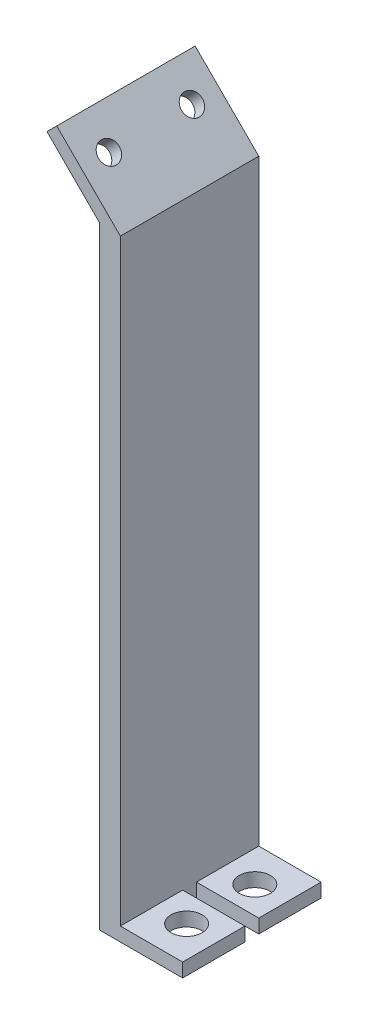
ISO-10303-21;
HEADER;
FILE_DESCRIPTION(('STEP AP214'),'2;1');
FILE_NAME('part.step','',(''),(''),'','','');
FILE_SCHEMA(('AUTOMOTIVE_DESIGN { 1 0 10303 214 1 1 1 1 }'));
ENDSEC;
DATA;
#1=APPLICATION_CONTEXT('core data for automotive mechanical design processes');
#2=APPLICATION_PROTOCOL_DEFINITION('international standard','automotive_design',2000,#1);
#3=PRODUCT_CONTEXT('',#1,'mechanical');
#4=PRODUCT('Part','Part','',(#3));
#5=PRODUCT_RELATED_PRODUCT_CATEGORY('part','',(#4));
#6=PRODUCT_DEFINITION_FORMATION('','',#4);
#7=PRODUCT_DEFINITION_CONTEXT('part definition',#1,'design');
#8=PRODUCT_DEFINITION('design','',#6,#7);
#9=PRODUCT_DEFINITION_SHAPE('','',#8);
#10=(LENGTH_UNIT() NAMED_UNIT(*) SI_UNIT(.MILLI.,.METRE.));
#11=(NAMED_UNIT(*) PLANE_ANGLE_UNIT() SI_UNIT($,.RADIAN.));
#12=(NAMED_UNIT(*) SI_UNIT($,.STERADIAN.) SOLID_ANGLE_UNIT());
#13=UNCERTAINTY_MEASURE_WITH_UNIT(LENGTH_MEASURE(1.E-05),#10,'distance_accuracy_value','');
#14=(GEOMETRIC_REPRESENTATION_CONTEXT(3) GLOBAL_UNCERTAINTY_ASSIGNED_CONTEXT((#13)) GLOBAL_UNIT_ASSIGNED_CONTEXT((#10,
#11,#12)) REPRESENTATION_CONTEXT('',''));
#15=CARTESIAN_POINT('',(0.,0.,0.));
#16=DIRECTION('',(0.,0.,1.));
#17=DIRECTION('',(1.,0.,0.));
#18=AXIS2_PLACEMENT_3D('',#15,#16,#17);
#19=CARTESIAN_POINT('',(6.9375,6.9375,0.));
#20=DIRECTION('',(-0.707106781186549,-0.707106781186546,0.));
#21=DIRECTION('',(-0.707106781186546,0.707106781186549,0.));
#22=AXIS2_PLACEMENT_3D('',#19,#20,#21);
#23=PLANE('',#22);
#24=CARTESIAN_POINT('',(4.80393218813452,9.07106781186549,10.375));
#25=DIRECTION('',(0.707106781186549,0.707106781186547,0.));
#26=DIRECTION('',(0.707106781186547,-0.707106781186549,0.));
#27=AXIS2_PLACEMENT_3D('',#24,#25,#26);
#28=CIRCLE('',#27,1.5);
#29=CARTESIAN_POINT('',(5.86459235991434,8.01040764008567,10.375));
#30=VERTEX_POINT('',#29);
#31=EDGE_CURVE('E325',#30,#30,#28,.T.);
#32=ORIENTED_EDGE('',*,*,#31,.T.);
#33=EDGE_LOOP('',(#32));
#34=FACE_BOUND('',#33,.T.);
#35=CARTESIAN_POINT('',(4.80393218813452,9.07106781186549,-1.62499999999996));
#36=DIRECTION('',(0.707106781186549,0.707106781186546,0.));
#37=DIRECTION('',(0.707106781186546,-0.707106781186549,0.));
#38=AXIS2_PLACEMENT_3D('',#35,#36,#37);
#39=CIRCLE('',#38,1.5);
#40=CARTESIAN_POINT('',(5.86459235991434,8.01040764008567,-1.62499999999996));
#41=VERTEX_POINT('',#40);
#42=EDGE_CURVE('E352',#41,#41,#39,.T.);
#43=ORIENTED_EDGE('',*,*,#42,.T.);
#44=EDGE_LOOP('',(#43));
#45=FACE_BOUND('',#44,.T.);
#46=DIRECTION('',(-0.707106781186546,0.707106781186549,0.));
#47=VECTOR('',#46,1.);
#48=CARTESIAN_POINT('',(1.26839828220179,12.6066017177982,-5.625));
#49=LINE('',#48,#47);
#50=CARTESIAN_POINT('',(8.875,5.,-5.625));
#51=VERTEX_POINT('',#50);
#52=CARTESIAN_POINT('',(1.26839828220179,12.6066017177982,-5.625));
#53=VERTEX_POINT('',#52);
#54=EDGE_CURVE('E245',#51,#53,#49,.T.);
#55=ORIENTED_EDGE('',*,*,#54,.F.);
#56=DIRECTION('',(0.,0.,1.));
#57=VECTOR('',#56,1.);
#58=CARTESIAN_POINT('',(8.875,5.,-5.625));
#59=LINE('',#58,#57);
#60=CARTESIAN_POINT('',(8.875,5.,14.375));
#61=VERTEX_POINT('',#60);
#62=EDGE_CURVE('E270',#51,#61,#59,.T.);
#63=ORIENTED_EDGE('',*,*,#62,.T.);
#64=DIRECTION('',(0.707106781186546,-0.707106781186549,0.));
#65=VECTOR('',#64,1.);
#66=CARTESIAN_POINT('',(1.26839828220179,12.6066017177982,14.375));
#67=LINE('',#66,#65);
#68=CARTESIAN_POINT('',(1.26839828220179,12.6066017177982,14.375));
#69=VERTEX_POINT('',#68);
#70=EDGE_CURVE('E167',#69,#61,#67,.T.);
#71=ORIENTED_EDGE('',*,*,#70,.F.);
#72=DIRECTION('',(0.,0.,1.));
#73=VECTOR('',#72,1.);
#74=CARTESIAN_POINT('',(1.26839828220179,12.6066017177982,14.375));
#75=LINE('',#74,#73);
#76=EDGE_CURVE('E20',#53,#69,#75,.T.);
#77=ORIENTED_EDGE('',*,*,#76,.F.);
#78=EDGE_LOOP('',(#55,#63,#71,#77));
#79=FACE_BOUND('',#78,.T.);
#80=ADVANCED_FACE('F17',(#34,#45,#79),#23,.T.);
#81=CARTESIAN_POINT('',(8.35171356237311,8.35171356237308,0.));
#82=DIRECTION('',(-0.707106781186549,-0.707106781186546,0.));
#83=DIRECTION('',(-0.707106781186546,0.707106781186549,0.));
#84=AXIS2_PLACEMENT_3D('',#81,#82,#83);
#85=PLANE('',#84);
#86=CARTESIAN_POINT('',(6.21814575050762,10.4852813742386,10.375));
#87=DIRECTION('',(0.707106781186549,0.707106781186547,0.));
#88=DIRECTION('',(-0.707106781186547,0.707106781186549,0.));
#89=AXIS2_PLACEMENT_3D('',#86,#87,#88);
#90=CIRCLE('',#89,1.5);
#91=CARTESIAN_POINT('',(5.1574855787278,11.5459415460184,10.375));
#92=VERTEX_POINT('',#91);
#93=EDGE_CURVE('E177',#92,#92,#90,.T.);
#94=ORIENTED_EDGE('',*,*,#93,.F.);
#95=EDGE_LOOP('',(#94));
#96=FACE_BOUND('',#95,.T.);
#97=CARTESIAN_POINT('',(6.21814575050762,10.4852813742386,-1.62499999999996));
#98=DIRECTION('',(0.707106781186549,0.707106781186546,0.));
#99=DIRECTION('',(-0.707106781186546,0.707106781186549,0.));
#100=AXIS2_PLACEMENT_3D('',#97,#98,#99);
#101=CIRCLE('',#100,1.5);
#102=CARTESIAN_POINT('',(5.1574855787278,11.5459415460184,-1.62499999999996));
#103=VERTEX_POINT('',#102);
#104=EDGE_CURVE('E330',#103,#103,#101,.T.);
#105=ORIENTED_EDGE('',*,*,#104,.F.);
#106=EDGE_LOOP('',(#105));
#107=FACE_BOUND('',#106,.T.);
#108=DIRECTION('',(0.707106781186546,-0.707106781186549,0.));
#109=VECTOR('',#108,1.);
#110=CARTESIAN_POINT('',(2.68261184457489,14.0208152801713,14.375));
#111=LINE('',#110,#109);
#112=CARTESIAN_POINT('',(2.68261184457489,14.0208152801713,14.375));
#113=VERTEX_POINT('',#112);
#114=CARTESIAN_POINT('',(11.875,4.8284271247462,14.375));
#115=VERTEX_POINT('',#114);
#116=EDGE_CURVE('E264',#113,#115,#111,.T.);
#117=ORIENTED_EDGE('',*,*,#116,.T.);
#118=DIRECTION('',(0.,0.,-1.));
#119=VECTOR('',#118,1.);
#120=CARTESIAN_POINT('',(11.875,4.82842712474619,14.376));
#121=LINE('',#120,#119);
#122=CARTESIAN_POINT('',(11.875,4.82842712474619,-5.625));
#123=VERTEX_POINT('',#122);
#124=EDGE_CURVE('E232',#115,#123,#121,.T.);
#125=ORIENTED_EDGE('',*,*,#124,.T.);
#126=DIRECTION('',(-0.707106781186546,0.707106781186549,0.));
#127=VECTOR('',#126,1.);
#128=CARTESIAN_POINT('',(2.68261184457489,14.0208152801713,-5.625));
#129=LINE('',#128,#127);
#130=CARTESIAN_POINT('',(2.68261184457489,14.0208152801713,-5.625));
#131=VERTEX_POINT('',#130);
#132=EDGE_CURVE('E253',#123,#131,#129,.T.);
#133=ORIENTED_EDGE('',*,*,#132,.T.);
#134=DIRECTION('',(0.,0.,1.));
#135=VECTOR('',#134,1.);
#136=CARTESIAN_POINT('',(2.68261184457489,14.0208152801713,14.375));
#137=LINE('',#136,#135);
#138=EDGE_CURVE('E11',#131,#113,#137,.T.);
#139=ORIENTED_EDGE('',*,*,#138,.T.);
#140=EDGE_LOOP('',(#117,#125,#133,#139));
#141=FACE_BOUND('',#140,.T.);
#142=ADVANCED_FACE('F293',(#96,#107,#141),#85,.F.);
#143=CARTESIAN_POINT('',(2.68261184457489,14.0208152801713,14.375));
#144=DIRECTION('',(0.707106781186546,-0.707106781186549,0.));
#145=DIRECTION('',(0.,0.,-1.));
#146=AXIS2_PLACEMENT_3D('',#143,#144,#145);
#147=PLANE('',#146);
#148=ORIENTED_EDGE('',*,*,#76,.T.);
#149=DIRECTION('',(-0.707106781186549,-0.707106781186546,0.));
#150=VECTOR('',#149,1.);
#151=CARTESIAN_POINT('',(2.68261184457489,14.0208152801713,14.375));
#152=LINE('',#151,#150);
#153=EDGE_CURVE('E267',#113,#69,#152,.T.);
#154=ORIENTED_EDGE('',*,*,#153,.F.);
#155=ORIENTED_EDGE('',*,*,#138,.F.);
#156=DIRECTION('',(-0.707106781186549,-0.707106781186546,0.));
#157=VECTOR('',#156,1.);
#158=CARTESIAN_POINT('',(2.68261184457489,14.0208152801713,-5.625));
#159=LINE('',#158,#157);
#160=EDGE_CURVE('E249',#131,#53,#159,.T.);
#161=ORIENTED_EDGE('',*,*,#160,.T.);
#162=EDGE_LOOP('',(#148,#154,#155,#161));
#163=FACE_BOUND('',#162,.T.);
#164=ADVANCED_FACE('F297',(#163),#147,.F.);
#165=CARTESIAN_POINT('',(11.875,-91.5,5.375));
#166=DIRECTION('',(0.,0.,1.));
#167=DIRECTION('',(1.,0.,0.));
#168=AXIS2_PLACEMENT_3D('',#165,#166,#167);
#169=PLANE('',#168);
#170=DIRECTION('',(-1.,0.,0.));
#171=VECTOR('',#170,1.);
#172=CARTESIAN_POINT('',(0.,-83.5,5.375));
#173=LINE('',#172,#171);
#174=CARTESIAN_POINT('',(20.875,-83.5,5.375));
#175=VERTEX_POINT('',#174);
#176=CARTESIAN_POINT('',(11.875,-83.5,5.375));
#177=VERTEX_POINT('',#176);
#178=EDGE_CURVE('E39',#175,#177,#173,.T.);
#179=ORIENTED_EDGE('',*,*,#178,.T.);
#180=DIRECTION('',(0.,1.,0.));
#181=VECTOR('',#180,1.);
#182=CARTESIAN_POINT('',(11.875,-91.5,5.375));
#183=LINE('',#182,#181);
#184=CARTESIAN_POINT('',(11.875,-81.5,5.375));
#185=VERTEX_POINT('',#184);
#186=EDGE_CURVE('E192',#177,#185,#183,.T.);
#187=ORIENTED_EDGE('',*,*,#186,.T.);
#188=DIRECTION('',(1.,0.,0.));
#189=VECTOR('',#188,1.);
#190=CARTESIAN_POINT('',(11.875,-81.5,5.375));
#191=LINE('',#190,#189);
#192=CARTESIAN_POINT('',(20.875,-81.5,5.375));
#193=VERTEX_POINT('',#192);
#194=EDGE_CURVE('E144',#185,#193,#191,.T.);
#195=ORIENTED_EDGE('',*,*,#194,.T.);
#196=DIRECTION('',(0.,1.,0.));
#197=VECTOR('',#196,1.);
#198=CARTESIAN_POINT('',(20.875,-91.5,5.375));
#199=LINE('',#198,#197);
#200=EDGE_CURVE('E49',#175,#193,#199,.T.);
#201=ORIENTED_EDGE('',*,*,#200,.F.);
#202=EDGE_LOOP('',(#179,#187,#195,#201));
#203=FACE_BOUND('',#202,.T.);
#204=ADVANCED_FACE('F280',(#203),#169,.F.);
#205=CARTESIAN_POINT('',(11.875,-91.5,3.37500000000004));
#206=DIRECTION('',(0.,0.,-1.));
#207=DIRECTION('',(-1.,0.,0.));
#208=AXIS2_PLACEMENT_3D('',#205,#206,#207);
#209=PLANE('',#208);
#210=DIRECTION('',(1.,0.,0.));
#211=VECTOR('',#210,1.);
#212=CARTESIAN_POINT('',(0.,-83.5,3.37500000000004));
#213=LINE('',#212,#211);
#214=CARTESIAN_POINT('',(11.875,-83.5,3.37500000000004));
#215=VERTEX_POINT('',#214);
#216=CARTESIAN_POINT('',(20.875,-83.5,3.37500000000004));
#217=VERTEX_POINT('',#216);
#218=EDGE_CURVE('E219',#215,#217,#213,.T.);
#219=ORIENTED_EDGE('',*,*,#218,.T.);
#220=DIRECTION('',(0.,1.,0.));
#221=VECTOR('',#220,1.);
#222=CARTESIAN_POINT('',(20.875,-91.5,3.37500000000004));
#223=LINE('',#222,#221);
#224=CARTESIAN_POINT('',(20.875,-81.5,3.37500000000004));
#225=VERTEX_POINT('',#224);
#226=EDGE_CURVE('E183',#217,#225,#223,.T.);
#227=ORIENTED_EDGE('',*,*,#226,.T.);
#228=DIRECTION('',(-1.,0.,0.));
#229=VECTOR('',#228,1.);
#230=CARTESIAN_POINT('',(11.875,-81.5,3.37500000000004));
#231=LINE('',#230,#229);
#232=CARTESIAN_POINT('',(11.875,-81.5,3.37500000000004));
#233=VERTEX_POINT('',#232);
#234=EDGE_CURVE('E202',#225,#233,#231,.T.);
#235=ORIENTED_EDGE('',*,*,#234,.T.);
#236=DIRECTION('',(0.,1.,0.));
#237=VECTOR('',#236,1.);
#238=CARTESIAN_POINT('',(11.875,-91.5,3.37500000000004));
#239=LINE('',#238,#237);
#240=EDGE_CURVE('E231',#215,#233,#239,.T.);
#241=ORIENTED_EDGE('',*,*,#240,.F.);
#242=EDGE_LOOP('',(#219,#227,#235,#241));
#243=FACE_BOUND('',#242,.T.);
#244=ADVANCED_FACE('F430',(#243),#209,.F.);
#245=CARTESIAN_POINT('',(0.,-83.5,0.));
#246=DIRECTION('',(0.,-1.,0.));
#247=DIRECTION('',(0.,0.,-1.));
#248=AXIS2_PLACEMENT_3D('',#245,#246,#247);
#249=PLANE('',#248);
#250=CARTESIAN_POINT('',(16.375,-83.5,9.3));
#251=DIRECTION('',(0.,-1.,0.));
#252=DIRECTION('',(0.,0.,-1.));
#253=AXIS2_PLACEMENT_3D('',#250,#251,#252);
#254=CIRCLE('',#253,2.25);
#255=CARTESIAN_POINT('',(16.375,-83.5,7.05));
#256=VERTEX_POINT('',#255);
#257=EDGE_CURVE('E187',#256,#256,#254,.T.);
#258=ORIENTED_EDGE('',*,*,#257,.F.);
#259=EDGE_LOOP('',(#258));
#260=FACE_BOUND('',#259,.T.);
#261=CARTESIAN_POINT('',(16.375,-83.5,-0.549999999999967));
#262=DIRECTION('',(0.,-1.,0.));
#263=DIRECTION('',(0.,0.,-1.));
#264=AXIS2_PLACEMENT_3D('',#261,#262,#263);
#265=CIRCLE('',#264,2.25);
#266=CARTESIAN_POINT('',(16.375,-83.5,-2.79999999999997));
#267=VERTEX_POINT('',#266);
#268=EDGE_CURVE('E172',#267,#267,#265,.T.);
#269=ORIENTED_EDGE('',*,*,#268,.F.);
#270=EDGE_LOOP('',(#269));
#271=FACE_BOUND('',#270,.T.);
#272=ORIENTED_EDGE('',*,*,#218,.F.);
#273=DIRECTION('',(0.,0.,-1.));
#274=VECTOR('',#273,1.);
#275=CARTESIAN_POINT('',(11.875,-83.5,0.));
#276=LINE('',#275,#274);
#277=EDGE_CURVE('E225',#177,#215,#276,.T.);
#278=ORIENTED_EDGE('',*,*,#277,.F.);
#279=ORIENTED_EDGE('',*,*,#178,.F.);
#280=DIRECTION('',(0.,0.,1.));
#281=VECTOR('',#280,1.);
#282=CARTESIAN_POINT('',(20.875,-83.5,14.375));
#283=LINE('',#282,#281);
#284=CARTESIAN_POINT('',(20.875,-83.5,14.375));
#285=VERTEX_POINT('',#284);
#286=EDGE_CURVE('E137',#175,#285,#283,.T.);
#287=ORIENTED_EDGE('',*,*,#286,.T.);
#288=DIRECTION('',(-1.,0.,0.));
#289=VECTOR('',#288,1.);
#290=CARTESIAN_POINT('',(8.875,-83.5,14.375));
#291=LINE('',#290,#289);
#292=CARTESIAN_POINT('',(8.875,-83.5,14.375));
#293=VERTEX_POINT('',#292);
#294=EDGE_CURVE('E141',#285,#293,#291,.T.);
#295=ORIENTED_EDGE('',*,*,#294,.T.);
#296=DIRECTION('',(0.,0.,-1.));
#297=VECTOR('',#296,1.);
#298=CARTESIAN_POINT('',(8.875,-83.5,14.375));
#299=LINE('',#298,#297);
#300=CARTESIAN_POINT('',(8.875,-83.5,-5.625));
#301=VERTEX_POINT('',#300);
#302=EDGE_CURVE('E171',#293,#301,#299,.T.);
#303=ORIENTED_EDGE('',*,*,#302,.T.);
#304=DIRECTION('',(1.,0.,0.));
#305=VECTOR('',#304,1.);
#306=CARTESIAN_POINT('',(8.875,-83.5,-5.625));
#307=LINE('',#306,#305);
#308=CARTESIAN_POINT('',(20.875,-83.5,-5.625));
#309=VERTEX_POINT('',#308);
#310=EDGE_CURVE('E257',#301,#309,#307,.T.);
#311=ORIENTED_EDGE('',*,*,#310,.T.);
#312=DIRECTION('',(0.,0.,1.));
#313=VECTOR('',#312,1.);
#314=CARTESIAN_POINT('',(20.875,-83.5,14.375));
#315=LINE('',#314,#313);
#316=EDGE_CURVE('E178',#309,#217,#315,.T.);
#317=ORIENTED_EDGE('',*,*,#316,.T.);
#318=EDGE_LOOP('',(#272,#278,#279,#287,#295,#303,#311,#317));
#319=FACE_BOUND('',#318,.T.);
#320=ADVANCED_FACE('F139',(#260,#271,#319),#249,.T.);
#321=CARTESIAN_POINT('',(20.875,-83.5,14.375));
#322=DIRECTION('',(-1.,0.,0.));
#323=DIRECTION('',(0.,0.,1.));
#324=AXIS2_PLACEMENT_3D('',#321,#322,#323);
#325=PLANE('',#324);
#326=ORIENTED_EDGE('',*,*,#286,.F.);
#327=ORIENTED_EDGE('',*,*,#200,.T.);
#328=DIRECTION('',(0.,0.,1.));
#329=VECTOR('',#328,1.);
#330=CARTESIAN_POINT('',(20.875,-81.5,14.375));
#331=LINE('',#330,#329);
#332=CARTESIAN_POINT('',(20.875,-81.5,14.375));
#333=VERTEX_POINT('',#332);
#334=EDGE_CURVE('E150',#193,#333,#331,.T.);
#335=ORIENTED_EDGE('',*,*,#334,.T.);
#336=DIRECTION('',(0.,1.,0.));
#337=VECTOR('',#336,1.);
#338=CARTESIAN_POINT('',(20.875,-83.5,14.375));
#339=LINE('',#338,#337);
#340=EDGE_CURVE('E147',#285,#333,#339,.T.);
#341=ORIENTED_EDGE('',*,*,#340,.F.);
#342=EDGE_LOOP('',(#326,#327,#335,#341));
#343=FACE_BOUND('',#342,.T.);
#344=ADVANCED_FACE('F148',(#343),#325,.F.);
#345=CARTESIAN_POINT('',(0.,-81.5,0.));
#346=DIRECTION('',(0.,-1.,0.));
#347=DIRECTION('',(0.,0.,-1.));
#348=AXIS2_PLACEMENT_3D('',#345,#346,#347);
#349=PLANE('',#348);
#350=CARTESIAN_POINT('',(16.375,-81.5,9.3));
#351=DIRECTION('',(0.,1.,0.));
#352=DIRECTION('',(0.,0.,1.));
#353=AXIS2_PLACEMENT_3D('',#350,#351,#352);
#354=CIRCLE('',#353,2.25);
#355=CARTESIAN_POINT('',(16.375,-81.5,11.55));
#356=VERTEX_POINT('',#355);
#357=EDGE_CURVE('E197',#356,#356,#354,.T.);
#358=ORIENTED_EDGE('',*,*,#357,.F.);
#359=EDGE_LOOP('',(#358));
#360=FACE_BOUND('',#359,.T.);
#361=ORIENTED_EDGE('',*,*,#334,.F.);
#362=ORIENTED_EDGE('',*,*,#194,.F.);
#363=DIRECTION('',(0.,0.,1.));
#364=VECTOR('',#363,1.);
#365=CARTESIAN_POINT('',(11.875,-81.5,14.375));
#366=LINE('',#365,#364);
#367=CARTESIAN_POINT('',(11.875,-81.5,14.375));
#368=VERTEX_POINT('',#367);
#369=EDGE_CURVE('E188',#185,#368,#366,.T.);
#370=ORIENTED_EDGE('',*,*,#369,.T.);
#371=DIRECTION('',(-1.,0.,0.));
#372=VECTOR('',#371,1.);
#373=CARTESIAN_POINT('',(8.875,-81.5,14.375));
#374=LINE('',#373,#372);
#375=EDGE_CURVE('E154',#333,#368,#374,.T.);
#376=ORIENTED_EDGE('',*,*,#375,.F.);
#377=EDGE_LOOP('',(#361,#362,#370,#376));
#378=FACE_BOUND('',#377,.T.);
#379=ADVANCED_FACE('F284',(#360,#378),#349,.F.);
#380=CARTESIAN_POINT('',(8.875,-81.5,14.375));
#381=DIRECTION('',(1.,0.,0.));
#382=DIRECTION('',(0.,0.,1.));
#383=AXIS2_PLACEMENT_3D('',#380,#381,#382);
#384=PLANE('',#383);
#385=DIRECTION('',(0.,1.,0.));
#386=VECTOR('',#385,1.);
#387=CARTESIAN_POINT('',(8.875,-81.5,14.375));
#388=LINE('',#387,#386);
#389=EDGE_CURVE('E159',#293,#61,#388,.T.);
#390=ORIENTED_EDGE('',*,*,#389,.T.);
#391=ORIENTED_EDGE('',*,*,#62,.F.);
#392=DIRECTION('',(0.,1.,0.));
#393=VECTOR('',#392,1.);
#394=CARTESIAN_POINT('',(8.875,-81.5,-5.625));
#395=LINE('',#394,#393);
#396=EDGE_CURVE('E236',#301,#51,#395,.T.);
#397=ORIENTED_EDGE('',*,*,#396,.F.);
#398=ORIENTED_EDGE('',*,*,#302,.F.);
#399=EDGE_LOOP('',(#390,#391,#397,#398));
#400=FACE_BOUND('',#399,.T.);
#401=ADVANCED_FACE('F303',(#400),#384,.F.);
#402=CARTESIAN_POINT('',(-8.12501501326787,2.,14.375));
#403=DIRECTION('',(0.,0.,-1.));
#404=DIRECTION('',(0.,-1.,0.));
#405=AXIS2_PLACEMENT_3D('',#402,#403,#404);
#406=PLANE('',#405);
#407=ORIENTED_EDGE('',*,*,#70,.T.);
#408=ORIENTED_EDGE('',*,*,#389,.F.);
#409=ORIENTED_EDGE('',*,*,#294,.F.);
#410=ORIENTED_EDGE('',*,*,#340,.T.);
#411=ORIENTED_EDGE('',*,*,#375,.T.);
#412=DIRECTION('',(0.,-1.,0.));
#413=VECTOR('',#412,1.);
#414=CARTESIAN_POINT('',(11.875,2.,14.375));
#415=LINE('',#414,#413);
#416=EDGE_CURVE('E193',#115,#368,#415,.T.);
#417=ORIENTED_EDGE('',*,*,#416,.F.);
#418=ORIENTED_EDGE('',*,*,#116,.F.);
#419=ORIENTED_EDGE('',*,*,#153,.T.);
#420=EDGE_LOOP('',(#407,#408,#409,#410,#411,#417,#418,#419));
#421=FACE_BOUND('',#420,.T.);
#422=ADVANCED_FACE('F157',(#421),#406,.F.);
#423=CARTESIAN_POINT('',(-8.125,2.,-5.625));
#424=DIRECTION('',(0.,0.,1.));
#425=DIRECTION('',(1.,0.,0.));
#426=AXIS2_PLACEMENT_3D('',#423,#424,#425);
#427=PLANE('',#426);
#428=ORIENTED_EDGE('',*,*,#396,.T.);
#429=ORIENTED_EDGE('',*,*,#54,.T.);
#430=ORIENTED_EDGE('',*,*,#160,.F.);
#431=ORIENTED_EDGE('',*,*,#132,.F.);
#432=DIRECTION('',(0.,-1.,0.));
#433=VECTOR('',#432,1.);
#434=CARTESIAN_POINT('',(11.875,2.,-5.625));
#435=LINE('',#434,#433);
#436=CARTESIAN_POINT('',(11.875,-81.5,-5.625));
#437=VERTEX_POINT('',#436);
#438=EDGE_CURVE('E237',#123,#437,#435,.T.);
#439=ORIENTED_EDGE('',*,*,#438,.T.);
#440=DIRECTION('',(1.,0.,0.));
#441=VECTOR('',#440,1.);
#442=CARTESIAN_POINT('',(8.875,-81.5,-5.625));
#443=LINE('',#442,#441);
#444=CARTESIAN_POINT('',(20.875,-81.5,-5.625));
#445=VERTEX_POINT('',#444);
#446=EDGE_CURVE('E210',#437,#445,#443,.T.);
#447=ORIENTED_EDGE('',*,*,#446,.T.);
#448=DIRECTION('',(0.,1.,0.));
#449=VECTOR('',#448,1.);
#450=CARTESIAN_POINT('',(20.875,-83.5,-5.625));
#451=LINE('',#450,#449);
#452=EDGE_CURVE('E182',#309,#445,#451,.T.);
#453=ORIENTED_EDGE('',*,*,#452,.F.);
#454=ORIENTED_EDGE('',*,*,#310,.F.);
#455=EDGE_LOOP('',(#428,#429,#430,#431,#439,#447,#453,#454));
#456=FACE_BOUND('',#455,.T.);
#457=ADVANCED_FACE('F409',(#456),#427,.F.);
#458=CARTESIAN_POINT('',(11.875,2.,-5.625));
#459=DIRECTION('',(-1.,0.,0.));
#460=DIRECTION('',(0.,1.,0.));
#461=AXIS2_PLACEMENT_3D('',#458,#459,#460);
#462=PLANE('',#461);
#463=ORIENTED_EDGE('',*,*,#416,.T.);
#464=ORIENTED_EDGE('',*,*,#369,.F.);
#465=ORIENTED_EDGE('',*,*,#186,.F.);
#466=ORIENTED_EDGE('',*,*,#277,.T.);
#467=ORIENTED_EDGE('',*,*,#240,.T.);
#468=DIRECTION('',(0.,0.,1.));
#469=VECTOR('',#468,1.);
#470=CARTESIAN_POINT('',(11.875,-81.5,14.375));
#471=LINE('',#470,#469);
#472=EDGE_CURVE('E198',#437,#233,#471,.T.);
#473=ORIENTED_EDGE('',*,*,#472,.F.);
#474=ORIENTED_EDGE('',*,*,#438,.F.);
#475=ORIENTED_EDGE('',*,*,#124,.F.);
#476=EDGE_LOOP('',(#463,#464,#465,#466,#467,#473,#474,#475));
#477=FACE_BOUND('',#476,.T.);
#478=ADVANCED_FACE('F289',(#477),#462,.F.);
#479=CARTESIAN_POINT('',(20.875,-83.5,14.375));
#480=DIRECTION('',(-1.,0.,0.));
#481=DIRECTION('',(0.,0.,1.));
#482=AXIS2_PLACEMENT_3D('',#479,#480,#481);
#483=PLANE('',#482);
#484=DIRECTION('',(0.,0.,1.));
#485=VECTOR('',#484,1.);
#486=CARTESIAN_POINT('',(20.875,-81.5,14.375));
#487=LINE('',#486,#485);
#488=EDGE_CURVE('E206',#445,#225,#487,.T.);
#489=ORIENTED_EDGE('',*,*,#488,.T.);
#490=ORIENTED_EDGE('',*,*,#226,.F.);
#491=ORIENTED_EDGE('',*,*,#316,.F.);
#492=ORIENTED_EDGE('',*,*,#452,.T.);
#493=EDGE_LOOP('',(#489,#490,#491,#492));
#494=FACE_BOUND('',#493,.T.);
#495=ADVANCED_FACE('F419',(#494),#483,.F.);
#496=CARTESIAN_POINT('',(0.,-81.5,0.));
#497=DIRECTION('',(0.,-1.,0.));
#498=DIRECTION('',(0.,0.,-1.));
#499=AXIS2_PLACEMENT_3D('',#496,#497,#498);
#500=PLANE('',#499);
#501=CARTESIAN_POINT('',(16.375,-81.5,-0.549999999999967));
#502=DIRECTION('',(0.,1.,0.));
#503=DIRECTION('',(0.,0.,1.));
#504=AXIS2_PLACEMENT_3D('',#501,#502,#503);
#505=CIRCLE('',#504,2.25);
#506=CARTESIAN_POINT('',(16.375,-81.5,1.70000000000003));
#507=VERTEX_POINT('',#506);
#508=EDGE_CURVE('E176',#507,#507,#505,.T.);
#509=ORIENTED_EDGE('',*,*,#508,.F.);
#510=EDGE_LOOP('',(#509));
#511=FACE_BOUND('',#510,.T.);
#512=ORIENTED_EDGE('',*,*,#472,.T.);
#513=ORIENTED_EDGE('',*,*,#234,.F.);
#514=ORIENTED_EDGE('',*,*,#488,.F.);
#515=ORIENTED_EDGE('',*,*,#446,.F.);
#516=EDGE_LOOP('',(#512,#513,#514,#515));
#517=FACE_BOUND('',#516,.T.);
#518=ADVANCED_FACE('F412',(#511,#517),#500,.F.);
#519=CARTESIAN_POINT('',(16.375,-91.5,9.3));
#520=DIRECTION('',(0.,1.,0.));
#521=DIRECTION('',(0.,0.,1.));
#522=AXIS2_PLACEMENT_3D('',#519,#520,#521);
#523=CYLINDRICAL_SURFACE('',#522,2.25);
#524=ORIENTED_EDGE('',*,*,#357,.T.);
#525=EDGE_LOOP('',(#524));
#526=FACE_BOUND('',#525,.T.);
#527=ORIENTED_EDGE('',*,*,#257,.T.);
#528=EDGE_LOOP('',(#527));
#529=FACE_BOUND('',#528,.T.);
#530=ADVANCED_FACE('F405',(#526,#529),#523,.F.);
#531=CARTESIAN_POINT('',(16.375,-91.5,-0.549999999999967));
#532=DIRECTION('',(0.,1.,0.));
#533=DIRECTION('',(0.,0.,1.));
#534=AXIS2_PLACEMENT_3D('',#531,#532,#533);
#535=CYLINDRICAL_SURFACE('',#534,2.25);
#536=ORIENTED_EDGE('',*,*,#508,.T.);
#537=EDGE_LOOP('',(#536));
#538=FACE_BOUND('',#537,.T.);
#539=ORIENTED_EDGE('',*,*,#268,.T.);
#540=EDGE_LOOP('',(#539));
#541=FACE_BOUND('',#540,.T.);
#542=ADVANCED_FACE('F382',(#538,#541),#535,.F.);
#543=CARTESIAN_POINT('',(-52.9470715651839,-48.6799359414527,10.375));
#544=DIRECTION('',(0.70710678118655,0.707106781186545,0.));
#545=DIRECTION('',(-0.707106781186545,0.70710678118655,0.));
#546=AXIS2_PLACEMENT_3D('',#543,#544,#545);
#547=CYLINDRICAL_SURFACE('',#546,1.5);
#548=ORIENTED_EDGE('',*,*,#93,.T.);
#549=EDGE_LOOP('',(#548));
#550=FACE_BOUND('',#549,.T.);
#551=ORIENTED_EDGE('',*,*,#31,.F.);
#552=EDGE_LOOP('',(#551));
#553=FACE_BOUND('',#552,.T.);
#554=ADVANCED_FACE('F375',(#550,#553),#547,.F.);
#555=CARTESIAN_POINT('',(-52.9470715651839,-48.6799359414528,-1.62499999999996));
#556=DIRECTION('',(0.70710678118655,0.707106781186545,0.));
#557=DIRECTION('',(-0.707106781186545,0.70710678118655,0.));
#558=AXIS2_PLACEMENT_3D('',#555,#556,#557);
#559=CYLINDRICAL_SURFACE('',#558,1.5);
#560=ORIENTED_EDGE('',*,*,#104,.T.);
#561=EDGE_LOOP('',(#560));
#562=FACE_BOUND('',#561,.T.);
#563=ORIENTED_EDGE('',*,*,#42,.F.);
#564=EDGE_LOOP('',(#563));
#565=FACE_BOUND('',#564,.T.);
#566=ADVANCED_FACE('F373',(#562,#565),#559,.F.);
#567=CLOSED_SHELL('',(#80,#142,#164,#204,#244,#320,#344,#379,#401,#422,#457,#478,#495,#518,#530,
#542,#554,#566));
#568=MANIFOLD_SOLID_BREP('B1',#567);
#569=ADVANCED_BREP_SHAPE_REPRESENTATION('',(#18,#568),#14);
#570=SHAPE_DEFINITION_REPRESENTATION(#9,#569);
ENDSEC;
END-ISO-10303-21;
